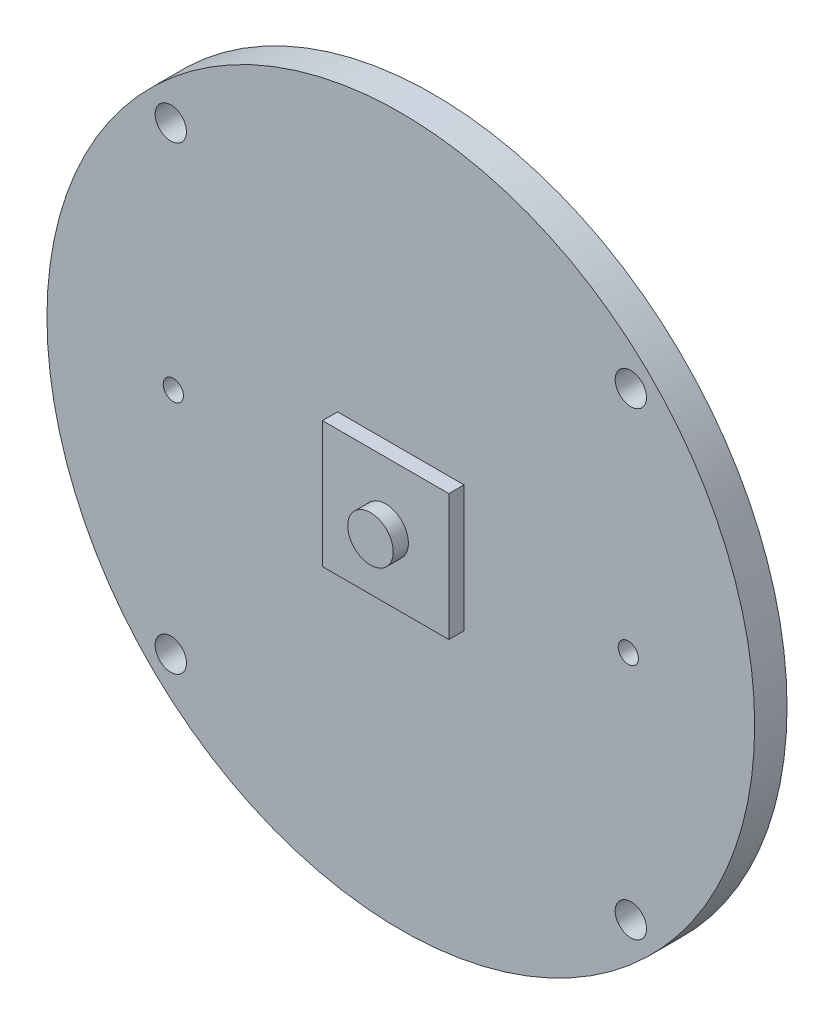
ISO-10303-21;
HEADER;
FILE_DESCRIPTION(('STEP AP214'),'2;1');
FILE_NAME('part.step','',(''),(''),'','','');
FILE_SCHEMA(('AUTOMOTIVE_DESIGN { 1 0 10303 214 1 1 1 1 }'));
ENDSEC;
DATA;
#1=APPLICATION_CONTEXT('core data for automotive mechanical design processes');
#2=APPLICATION_PROTOCOL_DEFINITION('international standard','automotive_design',2000,#1);
#3=PRODUCT_CONTEXT('',#1,'mechanical');
#4=PRODUCT('Part','Part','',(#3));
#5=PRODUCT_RELATED_PRODUCT_CATEGORY('part','',(#4));
#6=PRODUCT_DEFINITION_FORMATION('','',#4);
#7=PRODUCT_DEFINITION_CONTEXT('part definition',#1,'design');
#8=PRODUCT_DEFINITION('design','',#6,#7);
#9=PRODUCT_DEFINITION_SHAPE('','',#8);
#10=(LENGTH_UNIT() NAMED_UNIT(*) SI_UNIT(.MILLI.,.METRE.));
#11=(NAMED_UNIT(*) PLANE_ANGLE_UNIT() SI_UNIT($,.RADIAN.));
#12=(NAMED_UNIT(*) SI_UNIT($,.STERADIAN.) SOLID_ANGLE_UNIT());
#13=UNCERTAINTY_MEASURE_WITH_UNIT(LENGTH_MEASURE(1.E-05),#10,'distance_accuracy_value','');
#14=(GEOMETRIC_REPRESENTATION_CONTEXT(3) GLOBAL_UNCERTAINTY_ASSIGNED_CONTEXT((#13)) GLOBAL_UNIT_ASSIGNED_CONTEXT((#10,
#11,#12)) REPRESENTATION_CONTEXT('',''));
#15=CARTESIAN_POINT('',(0.,0.,0.));
#16=DIRECTION('',(0.,0.,1.));
#17=DIRECTION('',(1.,0.,0.));
#18=AXIS2_PLACEMENT_3D('',#15,#16,#17);
#19=CARTESIAN_POINT('',(0.,0.,2.3876));
#20=DIRECTION('',(0.,0.,1.));
#21=DIRECTION('',(1.,0.,0.));
#22=AXIS2_PLACEMENT_3D('',#19,#20,#21);
#23=PLANE('',#22);
#24=DIRECTION('',(0.,1.,0.));
#25=VECTOR('',#24,1.);
#26=CARTESIAN_POINT('',(3.175,3.175,2.3876));
#27=LINE('',#26,#25);
#28=CARTESIAN_POINT('',(3.175,-3.175,2.3876));
#29=VERTEX_POINT('',#28);
#30=CARTESIAN_POINT('',(3.175,3.175,2.3876));
#31=VERTEX_POINT('',#30);
#32=EDGE_CURVE('E82',#29,#31,#27,.T.);
#33=ORIENTED_EDGE('',*,*,#32,.T.);
#34=DIRECTION('',(-1.,0.,0.));
#35=VECTOR('',#34,1.);
#36=CARTESIAN_POINT('',(-3.175,3.175,2.3876));
#37=LINE('',#36,#35);
#38=CARTESIAN_POINT('',(-3.175,3.175,2.3876));
#39=VERTEX_POINT('',#38);
#40=EDGE_CURVE('E77',#31,#39,#37,.T.);
#41=ORIENTED_EDGE('',*,*,#40,.T.);
#42=DIRECTION('',(0.,-1.,0.));
#43=VECTOR('',#42,1.);
#44=CARTESIAN_POINT('',(-3.175,3.175,2.3876));
#45=LINE('',#44,#43);
#46=CARTESIAN_POINT('',(-3.175,-3.175,2.3876));
#47=VERTEX_POINT('',#46);
#48=EDGE_CURVE('E80',#39,#47,#45,.T.);
#49=ORIENTED_EDGE('',*,*,#48,.T.);
#50=DIRECTION('',(1.,0.,0.));
#51=VECTOR('',#50,1.);
#52=CARTESIAN_POINT('',(-3.175,-3.175,2.3876));
#53=LINE('',#52,#51);
#54=EDGE_CURVE('E56',#47,#29,#53,.T.);
#55=ORIENTED_EDGE('',*,*,#54,.T.);
#56=EDGE_LOOP('',(#33,#41,#49,#55));
#57=FACE_BOUND('',#56,.T.);
#58=CARTESIAN_POINT('',(0.,0.,2.3876));
#59=DIRECTION('',(0.,0.,1.));
#60=DIRECTION('',(1.,0.,0.));
#61=AXIS2_PLACEMENT_3D('',#58,#59,#60);
#62=CIRCLE('',#61,1.143);
#63=CARTESIAN_POINT('',(-1.143,0.,2.3876));
#64=VERTEX_POINT('',#63);
#65=EDGE_CURVE('E200',#64,#64,#62,.T.);
#66=ORIENTED_EDGE('',*,*,#65,.F.);
#67=EDGE_LOOP('',(#66));
#68=FACE_BOUND('',#67,.T.);
#69=ADVANCED_FACE('F33',(#57,#68),#23,.T.);
#70=CARTESIAN_POINT('',(0.,0.,1.6256));
#71=DIRECTION('',(0.,0.,1.));
#72=DIRECTION('',(1.,0.,0.));
#73=AXIS2_PLACEMENT_3D('',#70,#71,#72);
#74=PLANE('',#73);
#75=CARTESIAN_POINT('',(-11.557,-11.557,1.6256));
#76=DIRECTION('',(0.,0.,1.));
#77=DIRECTION('',(1.,0.,0.));
#78=AXIS2_PLACEMENT_3D('',#75,#76,#77);
#79=CIRCLE('',#78,0.7874);
#80=CARTESIAN_POINT('',(-10.7696,-11.557,1.6256));
#81=VERTEX_POINT('',#80);
#82=EDGE_CURVE('E180',#81,#81,#79,.T.);
#83=ORIENTED_EDGE('',*,*,#82,.F.);
#84=EDGE_LOOP('',(#83));
#85=FACE_BOUND('',#84,.T.);
#86=CARTESIAN_POINT('',(11.557,-11.557,1.6256));
#87=DIRECTION('',(0.,0.,1.));
#88=DIRECTION('',(1.,0.,0.));
#89=AXIS2_PLACEMENT_3D('',#86,#87,#88);
#90=CIRCLE('',#89,0.787399999999999);
#91=CARTESIAN_POINT('',(12.3444,-11.557,1.6256));
#92=VERTEX_POINT('',#91);
#93=EDGE_CURVE('E182',#92,#92,#90,.T.);
#94=ORIENTED_EDGE('',*,*,#93,.F.);
#95=EDGE_LOOP('',(#94));
#96=FACE_BOUND('',#95,.T.);
#97=CARTESIAN_POINT('',(11.557,11.557,1.6256));
#98=DIRECTION('',(0.,0.,1.));
#99=DIRECTION('',(1.,0.,0.));
#100=AXIS2_PLACEMENT_3D('',#97,#98,#99);
#101=CIRCLE('',#100,0.787399999999999);
#102=CARTESIAN_POINT('',(12.3444,11.557,1.6256));
#103=VERTEX_POINT('',#102);
#104=EDGE_CURVE('E188',#103,#103,#101,.T.);
#105=ORIENTED_EDGE('',*,*,#104,.F.);
#106=EDGE_LOOP('',(#105));
#107=FACE_BOUND('',#106,.T.);
#108=CARTESIAN_POINT('',(-11.557,11.557,1.6256));
#109=DIRECTION('',(0.,0.,1.));
#110=DIRECTION('',(1.,0.,0.));
#111=AXIS2_PLACEMENT_3D('',#108,#109,#110);
#112=CIRCLE('',#111,0.7874);
#113=CARTESIAN_POINT('',(-10.7696,11.557,1.6256));
#114=VERTEX_POINT('',#113);
#115=EDGE_CURVE('E194',#114,#114,#112,.T.);
#116=ORIENTED_EDGE('',*,*,#115,.F.);
#117=EDGE_LOOP('',(#116));
#118=FACE_BOUND('',#117,.T.);
#119=CARTESIAN_POINT('',(0.,0.,1.6256));
#120=DIRECTION('',(0.,0.,1.));
#121=DIRECTION('',(1.,0.,0.));
#122=AXIS2_PLACEMENT_3D('',#119,#120,#121);
#123=CIRCLE('',#122,17.78);
#124=CARTESIAN_POINT('',(17.78,0.,1.6256));
#125=VERTEX_POINT('',#124);
#126=EDGE_CURVE('E11',#125,#125,#123,.T.);
#127=ORIENTED_EDGE('',*,*,#126,.T.);
#128=EDGE_LOOP('',(#127));
#129=FACE_BOUND('',#128,.T.);
#130=CARTESIAN_POINT('',(-11.43,0.,1.6256));
#131=DIRECTION('',(0.,0.,1.));
#132=DIRECTION('',(1.,0.,0.));
#133=AXIS2_PLACEMENT_3D('',#130,#131,#132);
#134=CIRCLE('',#133,0.508);
#135=CARTESIAN_POINT('',(-10.922,0.,1.6256));
#136=VERTEX_POINT('',#135);
#137=EDGE_CURVE('E115',#136,#136,#134,.T.);
#138=ORIENTED_EDGE('',*,*,#137,.F.);
#139=EDGE_LOOP('',(#138));
#140=FACE_BOUND('',#139,.T.);
#141=CARTESIAN_POINT('',(11.43,0.,1.6256));
#142=DIRECTION('',(0.,0.,1.));
#143=DIRECTION('',(1.,0.,0.));
#144=AXIS2_PLACEMENT_3D('',#141,#142,#143);
#145=CIRCLE('',#144,0.508);
#146=CARTESIAN_POINT('',(11.938,0.,1.6256));
#147=VERTEX_POINT('',#146);
#148=EDGE_CURVE('E111',#147,#147,#145,.T.);
#149=ORIENTED_EDGE('',*,*,#148,.F.);
#150=EDGE_LOOP('',(#149));
#151=FACE_BOUND('',#150,.T.);
#152=DIRECTION('',(-1.,0.,0.));
#153=VECTOR('',#152,1.);
#154=CARTESIAN_POINT('',(-3.175,3.175,1.6256));
#155=LINE('',#154,#153);
#156=CARTESIAN_POINT('',(3.175,3.175,1.6256));
#157=VERTEX_POINT('',#156);
#158=CARTESIAN_POINT('',(-3.175,3.175,1.6256));
#159=VERTEX_POINT('',#158);
#160=EDGE_CURVE('E89',#157,#159,#155,.T.);
#161=ORIENTED_EDGE('',*,*,#160,.F.);
#162=DIRECTION('',(0.,1.,0.));
#163=VECTOR('',#162,1.);
#164=CARTESIAN_POINT('',(3.175,3.175,1.6256));
#165=LINE('',#164,#163);
#166=CARTESIAN_POINT('',(3.175,-3.175,1.6256));
#167=VERTEX_POINT('',#166);
#168=EDGE_CURVE('E100',#167,#157,#165,.T.);
#169=ORIENTED_EDGE('',*,*,#168,.F.);
#170=DIRECTION('',(1.,0.,0.));
#171=VECTOR('',#170,1.);
#172=CARTESIAN_POINT('',(-3.175,-3.175,1.6256));
#173=LINE('',#172,#171);
#174=CARTESIAN_POINT('',(-3.175,-3.175,1.6256));
#175=VERTEX_POINT('',#174);
#176=EDGE_CURVE('E70',#175,#167,#173,.T.);
#177=ORIENTED_EDGE('',*,*,#176,.F.);
#178=DIRECTION('',(0.,-1.,0.));
#179=VECTOR('',#178,1.);
#180=CARTESIAN_POINT('',(-3.175,3.175,1.6256));
#181=LINE('',#180,#179);
#182=EDGE_CURVE('E105',#159,#175,#181,.T.);
#183=ORIENTED_EDGE('',*,*,#182,.F.);
#184=EDGE_LOOP('',(#161,#169,#177,#183));
#185=FACE_BOUND('',#184,.T.);
#186=ADVANCED_FACE('F126',(#85,#96,#107,#118,#129,#140,#151,#185),#74,.T.);
#187=CARTESIAN_POINT('',(0.,0.,1.6256));
#188=DIRECTION('',(0.,0.,-1.));
#189=DIRECTION('',(-1.,0.,0.));
#190=AXIS2_PLACEMENT_3D('',#187,#188,#189);
#191=CYLINDRICAL_SURFACE('',#190,17.78);
#192=ORIENTED_EDGE('',*,*,#126,.F.);
#193=EDGE_LOOP('',(#192));
#194=FACE_BOUND('',#193,.T.);
#195=CARTESIAN_POINT('',(0.,0.,0.));
#196=DIRECTION('',(0.,0.,1.));
#197=DIRECTION('',(1.,0.,0.));
#198=AXIS2_PLACEMENT_3D('',#195,#196,#197);
#199=CIRCLE('',#198,17.78);
#200=CARTESIAN_POINT('',(17.78,0.,0.));
#201=VERTEX_POINT('',#200);
#202=EDGE_CURVE('E37',#201,#201,#199,.T.);
#203=ORIENTED_EDGE('',*,*,#202,.T.);
#204=EDGE_LOOP('',(#203));
#205=FACE_BOUND('',#204,.T.);
#206=ADVANCED_FACE('F35',(#194,#205),#191,.T.);
#207=CARTESIAN_POINT('',(0.,0.,0.));
#208=DIRECTION('',(0.,0.,1.));
#209=DIRECTION('',(1.,0.,0.));
#210=AXIS2_PLACEMENT_3D('',#207,#208,#209);
#211=PLANE('',#210);
#212=CARTESIAN_POINT('',(-11.557,-11.557,0.));
#213=DIRECTION('',(0.,0.,1.));
#214=DIRECTION('',(1.,0.,0.));
#215=AXIS2_PLACEMENT_3D('',#212,#213,#214);
#216=CIRCLE('',#215,0.7874);
#217=CARTESIAN_POINT('',(-10.7696,-11.557,0.));
#218=VERTEX_POINT('',#217);
#219=EDGE_CURVE('E177',#218,#218,#216,.T.);
#220=ORIENTED_EDGE('',*,*,#219,.T.);
#221=EDGE_LOOP('',(#220));
#222=FACE_BOUND('',#221,.T.);
#223=CARTESIAN_POINT('',(11.557,-11.557,0.));
#224=DIRECTION('',(0.,0.,1.));
#225=DIRECTION('',(1.,0.,0.));
#226=AXIS2_PLACEMENT_3D('',#223,#224,#225);
#227=CIRCLE('',#226,0.787399999999999);
#228=CARTESIAN_POINT('',(12.3444,-11.557,0.));
#229=VERTEX_POINT('',#228);
#230=EDGE_CURVE('E185',#229,#229,#227,.T.);
#231=ORIENTED_EDGE('',*,*,#230,.T.);
#232=EDGE_LOOP('',(#231));
#233=FACE_BOUND('',#232,.T.);
#234=CARTESIAN_POINT('',(11.557,11.557,0.));
#235=DIRECTION('',(0.,0.,1.));
#236=DIRECTION('',(1.,0.,0.));
#237=AXIS2_PLACEMENT_3D('',#234,#235,#236);
#238=CIRCLE('',#237,0.787399999999999);
#239=CARTESIAN_POINT('',(12.3444,11.557,0.));
#240=VERTEX_POINT('',#239);
#241=EDGE_CURVE('E191',#240,#240,#238,.T.);
#242=ORIENTED_EDGE('',*,*,#241,.T.);
#243=EDGE_LOOP('',(#242));
#244=FACE_BOUND('',#243,.T.);
#245=CARTESIAN_POINT('',(-11.557,11.557,0.));
#246=DIRECTION('',(0.,0.,1.));
#247=DIRECTION('',(1.,0.,0.));
#248=AXIS2_PLACEMENT_3D('',#245,#246,#247);
#249=CIRCLE('',#248,0.7874);
#250=CARTESIAN_POINT('',(-10.7696,11.557,0.));
#251=VERTEX_POINT('',#250);
#252=EDGE_CURVE('E197',#251,#251,#249,.T.);
#253=ORIENTED_EDGE('',*,*,#252,.T.);
#254=EDGE_LOOP('',(#253));
#255=FACE_BOUND('',#254,.T.);
#256=CARTESIAN_POINT('',(11.43,0.,0.));
#257=DIRECTION('',(0.,0.,1.));
#258=DIRECTION('',(1.,0.,0.));
#259=AXIS2_PLACEMENT_3D('',#256,#257,#258);
#260=CIRCLE('',#259,0.508);
#261=CARTESIAN_POINT('',(11.938,0.,0.));
#262=VERTEX_POINT('',#261);
#263=EDGE_CURVE('E112',#262,#262,#260,.T.);
#264=ORIENTED_EDGE('',*,*,#263,.T.);
#265=EDGE_LOOP('',(#264));
#266=FACE_BOUND('',#265,.T.);
#267=CARTESIAN_POINT('',(-11.43,0.,0.));
#268=DIRECTION('',(0.,0.,1.));
#269=DIRECTION('',(1.,0.,0.));
#270=AXIS2_PLACEMENT_3D('',#267,#268,#269);
#271=CIRCLE('',#270,0.508);
#272=CARTESIAN_POINT('',(-10.922,0.,0.));
#273=VERTEX_POINT('',#272);
#274=EDGE_CURVE('E118',#273,#273,#271,.T.);
#275=ORIENTED_EDGE('',*,*,#274,.T.);
#276=EDGE_LOOP('',(#275));
#277=FACE_BOUND('',#276,.T.);
#278=ORIENTED_EDGE('',*,*,#202,.F.);
#279=EDGE_LOOP('',(#278));
#280=FACE_BOUND('',#279,.T.);
#281=ADVANCED_FACE('F217',(#222,#233,#244,#255,#266,#277,#280),#211,.F.);
#282=CARTESIAN_POINT('',(-11.43,0.,0.));
#283=DIRECTION('',(0.,0.,1.));
#284=DIRECTION('',(1.,0.,0.));
#285=AXIS2_PLACEMENT_3D('',#282,#283,#284);
#286=CYLINDRICAL_SURFACE('',#285,0.508);
#287=ORIENTED_EDGE('',*,*,#274,.F.);
#288=EDGE_LOOP('',(#287));
#289=FACE_BOUND('',#288,.T.);
#290=ORIENTED_EDGE('',*,*,#137,.T.);
#291=EDGE_LOOP('',(#290));
#292=FACE_BOUND('',#291,.T.);
#293=ADVANCED_FACE('F124',(#289,#292),#286,.F.);
#294=CARTESIAN_POINT('',(11.43,0.,0.));
#295=DIRECTION('',(0.,0.,1.));
#296=DIRECTION('',(1.,0.,0.));
#297=AXIS2_PLACEMENT_3D('',#294,#295,#296);
#298=CYLINDRICAL_SURFACE('',#297,0.508);
#299=ORIENTED_EDGE('',*,*,#263,.F.);
#300=EDGE_LOOP('',(#299));
#301=FACE_BOUND('',#300,.T.);
#302=ORIENTED_EDGE('',*,*,#148,.T.);
#303=EDGE_LOOP('',(#302));
#304=FACE_BOUND('',#303,.T.);
#305=ADVANCED_FACE('F227',(#301,#304),#298,.F.);
#306=CARTESIAN_POINT('',(3.175,3.175,2.3876));
#307=DIRECTION('',(-1.,0.,0.));
#308=DIRECTION('',(0.,-1.,0.));
#309=AXIS2_PLACEMENT_3D('',#306,#307,#308);
#310=PLANE('',#309);
#311=ORIENTED_EDGE('',*,*,#168,.T.);
#312=DIRECTION('',(0.,0.,-1.));
#313=VECTOR('',#312,1.);
#314=CARTESIAN_POINT('',(3.175,3.175,2.3876));
#315=LINE('',#314,#313);
#316=EDGE_CURVE('E92',#31,#157,#315,.T.);
#317=ORIENTED_EDGE('',*,*,#316,.F.);
#318=ORIENTED_EDGE('',*,*,#32,.F.);
#319=DIRECTION('',(0.,0.,-1.));
#320=VECTOR('',#319,1.);
#321=CARTESIAN_POINT('',(3.175,-3.175,2.3876));
#322=LINE('',#321,#320);
#323=EDGE_CURVE('E96',#29,#167,#322,.T.);
#324=ORIENTED_EDGE('',*,*,#323,.T.);
#325=EDGE_LOOP('',(#311,#317,#318,#324));
#326=FACE_BOUND('',#325,.T.);
#327=ADVANCED_FACE('F135',(#326),#310,.F.);
#328=CARTESIAN_POINT('',(-3.175,3.175,2.3876));
#329=DIRECTION('',(0.,-1.,0.));
#330=DIRECTION('',(0.,0.,-1.));
#331=AXIS2_PLACEMENT_3D('',#328,#329,#330);
#332=PLANE('',#331);
#333=ORIENTED_EDGE('',*,*,#160,.T.);
#334=DIRECTION('',(0.,0.,-1.));
#335=VECTOR('',#334,1.);
#336=CARTESIAN_POINT('',(-3.175,3.175,2.3876));
#337=LINE('',#336,#335);
#338=EDGE_CURVE('E86',#39,#159,#337,.T.);
#339=ORIENTED_EDGE('',*,*,#338,.F.);
#340=ORIENTED_EDGE('',*,*,#40,.F.);
#341=ORIENTED_EDGE('',*,*,#316,.T.);
#342=EDGE_LOOP('',(#333,#339,#340,#341));
#343=FACE_BOUND('',#342,.T.);
#344=ADVANCED_FACE('F87',(#343),#332,.F.);
#345=CARTESIAN_POINT('',(-3.175,3.175,2.3876));
#346=DIRECTION('',(1.,0.,0.));
#347=DIRECTION('',(0.,1.,0.));
#348=AXIS2_PLACEMENT_3D('',#345,#346,#347);
#349=PLANE('',#348);
#350=ORIENTED_EDGE('',*,*,#182,.T.);
#351=DIRECTION('',(0.,0.,-1.));
#352=VECTOR('',#351,1.);
#353=CARTESIAN_POINT('',(-3.175,-3.175,2.3876));
#354=LINE('',#353,#352);
#355=EDGE_CURVE('E48',#47,#175,#354,.T.);
#356=ORIENTED_EDGE('',*,*,#355,.F.);
#357=ORIENTED_EDGE('',*,*,#48,.F.);
#358=ORIENTED_EDGE('',*,*,#338,.T.);
#359=EDGE_LOOP('',(#350,#356,#357,#358));
#360=FACE_BOUND('',#359,.T.);
#361=ADVANCED_FACE('F94',(#360),#349,.F.);
#362=CARTESIAN_POINT('',(-3.175,-3.175,2.3876));
#363=DIRECTION('',(0.,1.,0.));
#364=DIRECTION('',(0.,0.,1.));
#365=AXIS2_PLACEMENT_3D('',#362,#363,#364);
#366=PLANE('',#365);
#367=ORIENTED_EDGE('',*,*,#176,.T.);
#368=ORIENTED_EDGE('',*,*,#323,.F.);
#369=ORIENTED_EDGE('',*,*,#54,.F.);
#370=ORIENTED_EDGE('',*,*,#355,.T.);
#371=EDGE_LOOP('',(#367,#368,#369,#370));
#372=FACE_BOUND('',#371,.T.);
#373=ADVANCED_FACE('F136',(#372),#366,.F.);
#374=CARTESIAN_POINT('',(0.,0.,3.1496));
#375=DIRECTION('',(0.,0.,-1.));
#376=DIRECTION('',(-1.,0.,0.));
#377=AXIS2_PLACEMENT_3D('',#374,#375,#376);
#378=CYLINDRICAL_SURFACE('',#377,1.143);
#379=CARTESIAN_POINT('',(0.,0.,3.1496));
#380=DIRECTION('',(0.,0.,1.));
#381=DIRECTION('',(1.,0.,0.));
#382=AXIS2_PLACEMENT_3D('',#379,#380,#381);
#383=CIRCLE('',#382,1.143);
#384=CARTESIAN_POINT('',(-1.143,0.,3.1496));
#385=VERTEX_POINT('',#384);
#386=EDGE_CURVE('E103',#385,#385,#383,.T.);
#387=CARTESIAN_POINT('',(-1.143,0.,3.1496));
#388=CARTESIAN_POINT('',(-1.143,0.,3.1416625));
#389=CARTESIAN_POINT('',(-1.143,0.,3.133725));
#390=CARTESIAN_POINT('',(-1.143,0.,3.11785));
#391=CARTESIAN_POINT('',(-1.143,0.,3.1099125));
#392=CARTESIAN_POINT('',(-1.143,0.,3.0940375));
#393=CARTESIAN_POINT('',(-1.143,0.,3.0861));
#394=CARTESIAN_POINT('',(-1.143,0.,3.070225));
#395=CARTESIAN_POINT('',(-1.143,0.,3.0622875));
#396=CARTESIAN_POINT('',(-1.143,0.,3.0464125));
#397=CARTESIAN_POINT('',(-1.143,0.,3.038475));
#398=CARTESIAN_POINT('',(-1.143,0.,3.0226));
#399=CARTESIAN_POINT('',(-1.143,0.,3.0146625));
#400=CARTESIAN_POINT('',(-1.143,0.,2.9987875));
#401=CARTESIAN_POINT('',(-1.143,0.,2.99085));
#402=CARTESIAN_POINT('',(-1.143,0.,2.974975));
#403=CARTESIAN_POINT('',(-1.143,0.,2.9670375));
#404=CARTESIAN_POINT('',(-1.143,0.,2.9511625));
#405=CARTESIAN_POINT('',(-1.143,0.,2.943225));
#406=CARTESIAN_POINT('',(-1.143,0.,2.92735));
#407=CARTESIAN_POINT('',(-1.143,0.,2.9194125));
#408=CARTESIAN_POINT('',(-1.143,0.,2.9035375));
#409=CARTESIAN_POINT('',(-1.143,0.,2.8956));
#410=CARTESIAN_POINT('',(-1.143,0.,2.879725));
#411=CARTESIAN_POINT('',(-1.143,0.,2.8717875));
#412=CARTESIAN_POINT('',(-1.143,0.,2.8559125));
#413=CARTESIAN_POINT('',(-1.143,0.,2.847975));
#414=CARTESIAN_POINT('',(-1.143,0.,2.8321));
#415=CARTESIAN_POINT('',(-1.143,0.,2.8241625));
#416=CARTESIAN_POINT('',(-1.143,0.,2.8082875));
#417=CARTESIAN_POINT('',(-1.143,0.,2.80035));
#418=CARTESIAN_POINT('',(-1.143,0.,2.784475));
#419=CARTESIAN_POINT('',(-1.143,0.,2.7765375));
#420=CARTESIAN_POINT('',(-1.143,0.,2.7606625));
#421=CARTESIAN_POINT('',(-1.143,0.,2.752725));
#422=CARTESIAN_POINT('',(-1.143,0.,2.73685));
#423=CARTESIAN_POINT('',(-1.143,0.,2.7289125));
#424=CARTESIAN_POINT('',(-1.143,0.,2.7130375));
#425=CARTESIAN_POINT('',(-1.143,0.,2.7051));
#426=CARTESIAN_POINT('',(-1.143,0.,2.689225));
#427=CARTESIAN_POINT('',(-1.143,0.,2.6812875));
#428=CARTESIAN_POINT('',(-1.143,0.,2.6654125));
#429=CARTESIAN_POINT('',(-1.143,0.,2.657475));
#430=CARTESIAN_POINT('',(-1.143,0.,2.6416));
#431=CARTESIAN_POINT('',(-1.143,0.,2.6336625));
#432=CARTESIAN_POINT('',(-1.143,0.,2.6177875));
#433=CARTESIAN_POINT('',(-1.143,0.,2.60985));
#434=CARTESIAN_POINT('',(-1.143,0.,2.593975));
#435=CARTESIAN_POINT('',(-1.143,0.,2.5860375));
#436=CARTESIAN_POINT('',(-1.143,0.,2.5701625));
#437=CARTESIAN_POINT('',(-1.143,0.,2.562225));
#438=CARTESIAN_POINT('',(-1.143,0.,2.54635));
#439=CARTESIAN_POINT('',(-1.143,0.,2.5384125));
#440=CARTESIAN_POINT('',(-1.143,0.,2.5225375));
#441=CARTESIAN_POINT('',(-1.143,0.,2.5146));
#442=CARTESIAN_POINT('',(-1.143,0.,2.498725));
#443=CARTESIAN_POINT('',(-1.143,0.,2.4907875));
#444=CARTESIAN_POINT('',(-1.143,0.,2.4749125));
#445=CARTESIAN_POINT('',(-1.143,0.,2.466975));
#446=CARTESIAN_POINT('',(-1.143,0.,2.4511));
#447=CARTESIAN_POINT('',(-1.143,0.,2.4431625));
#448=CARTESIAN_POINT('',(-1.143,0.,2.4272875));
#449=CARTESIAN_POINT('',(-1.143,0.,2.41935));
#450=CARTESIAN_POINT('',(-1.143,0.,2.403475));
#451=CARTESIAN_POINT('',(-1.143,0.,2.3955375));
#452=CARTESIAN_POINT('',(-1.143,0.,2.3876));
#453=B_SPLINE_CURVE_WITH_KNOTS('',3,(#387,#388,#389,#390,#391,#392,#393,#394,#395,#396,#397,
#398,#399,#400,#401,#402,#403,#404,#405,#406,#407,#408,#409,#410,#411,#412,#413,#414,#415,#416,
#417,#418,#419,#420,#421,#422,#423,#424,#425,#426,#427,#428,#429,#430,#431,#432,#433,#434,#435,
#436,#437,#438,#439,#440,#441,#442,#443,#444,#445,#446,#447,#448,#449,#450,#451,#452),
.UNSPECIFIED.,.F.,.F.,(4,2,2,2,2,2,2,2,2,2,2,2,2,2,2,2,2,2,2,2,2,2,2,2,2,2,2,2,2,2,2,2,4),(0.,
0.0238125,0.0476249999999999,0.0714374999999999,0.0952499999999998,0.1190625,0.142875,0.1666875,
0.1905,0.2143125,0.238125,0.2619375,0.28575,0.3095625,0.333375,0.3571875,0.381,0.4048125,
0.428625,0.4524375,0.47625,0.5000625,0.523875,0.5476875,0.5715,0.5953125,0.619125,0.6429375,
0.66675,0.6905625,0.714375,0.7381875,0.762),.UNSPECIFIED.);
#454=EDGE_CURVE('BSEAM138',#385,#64,#453,.T.);
#455=ORIENTED_EDGE('',*,*,#386,.F.);
#456=ORIENTED_EDGE('',*,*,#65,.T.);
#457=ORIENTED_EDGE('',*,*,#454,.T.);
#458=ORIENTED_EDGE('',*,*,#454,.F.);
#459=EDGE_LOOP('',(#455,#457,#456,#458));
#460=FACE_BOUND('',#459,.T.);
#461=ADVANCED_FACE('F138',(#460),#378,.T.);
#462=CARTESIAN_POINT('',(0.,0.,3.1496));
#463=DIRECTION('',(0.,0.,1.));
#464=DIRECTION('',(1.,0.,0.));
#465=AXIS2_PLACEMENT_3D('',#462,#463,#464);
#466=PLANE('',#465);
#467=ORIENTED_EDGE('',*,*,#386,.T.);
#468=EDGE_LOOP('',(#467));
#469=FACE_BOUND('',#468,.T.);
#470=ADVANCED_FACE('F144',(#469),#466,.T.);
#471=CARTESIAN_POINT('',(-11.557,11.557,0.));
#472=DIRECTION('',(0.,0.,1.));
#473=DIRECTION('',(1.,0.,0.));
#474=AXIS2_PLACEMENT_3D('',#471,#472,#473);
#475=CYLINDRICAL_SURFACE('',#474,0.7874);
#476=ORIENTED_EDGE('',*,*,#252,.F.);
#477=EDGE_LOOP('',(#476));
#478=FACE_BOUND('',#477,.T.);
#479=ORIENTED_EDGE('',*,*,#115,.T.);
#480=EDGE_LOOP('',(#479));
#481=FACE_BOUND('',#480,.T.);
#482=ADVANCED_FACE('F156',(#478,#481),#475,.F.);
#483=CARTESIAN_POINT('',(11.557,11.557,0.));
#484=DIRECTION('',(0.,0.,1.));
#485=DIRECTION('',(1.,0.,0.));
#486=AXIS2_PLACEMENT_3D('',#483,#484,#485);
#487=CYLINDRICAL_SURFACE('',#486,0.787399999999999);
#488=ORIENTED_EDGE('',*,*,#241,.F.);
#489=EDGE_LOOP('',(#488));
#490=FACE_BOUND('',#489,.T.);
#491=ORIENTED_EDGE('',*,*,#104,.T.);
#492=EDGE_LOOP('',(#491));
#493=FACE_BOUND('',#492,.T.);
#494=ADVANCED_FACE('F160',(#490,#493),#487,.F.);
#495=CARTESIAN_POINT('',(11.557,-11.557,0.));
#496=DIRECTION('',(0.,0.,1.));
#497=DIRECTION('',(1.,0.,0.));
#498=AXIS2_PLACEMENT_3D('',#495,#496,#497);
#499=CYLINDRICAL_SURFACE('',#498,0.787399999999999);
#500=ORIENTED_EDGE('',*,*,#230,.F.);
#501=EDGE_LOOP('',(#500));
#502=FACE_BOUND('',#501,.T.);
#503=ORIENTED_EDGE('',*,*,#93,.T.);
#504=EDGE_LOOP('',(#503));
#505=FACE_BOUND('',#504,.T.);
#506=ADVANCED_FACE('F164',(#502,#505),#499,.F.);
#507=CARTESIAN_POINT('',(-11.557,-11.557,0.));
#508=DIRECTION('',(0.,0.,1.));
#509=DIRECTION('',(1.,0.,0.));
#510=AXIS2_PLACEMENT_3D('',#507,#508,#509);
#511=CYLINDRICAL_SURFACE('',#510,0.7874);
#512=ORIENTED_EDGE('',*,*,#219,.F.);
#513=EDGE_LOOP('',(#512));
#514=FACE_BOUND('',#513,.T.);
#515=ORIENTED_EDGE('',*,*,#82,.T.);
#516=EDGE_LOOP('',(#515));
#517=FACE_BOUND('',#516,.T.);
#518=ADVANCED_FACE('F168',(#514,#517),#511,.F.);
#519=CLOSED_SHELL('',(#69,#186,#206,#281,#293,#305,#327,#344,#361,#373,#461,#470,#482,#494,#506,#518));
#520=MANIFOLD_SOLID_BREP('B2',#519);
#521=ADVANCED_BREP_SHAPE_REPRESENTATION('',(#18,#520),#14);
#522=SHAPE_DEFINITION_REPRESENTATION(#9,#521);
ENDSEC;
END-ISO-10303-21;
